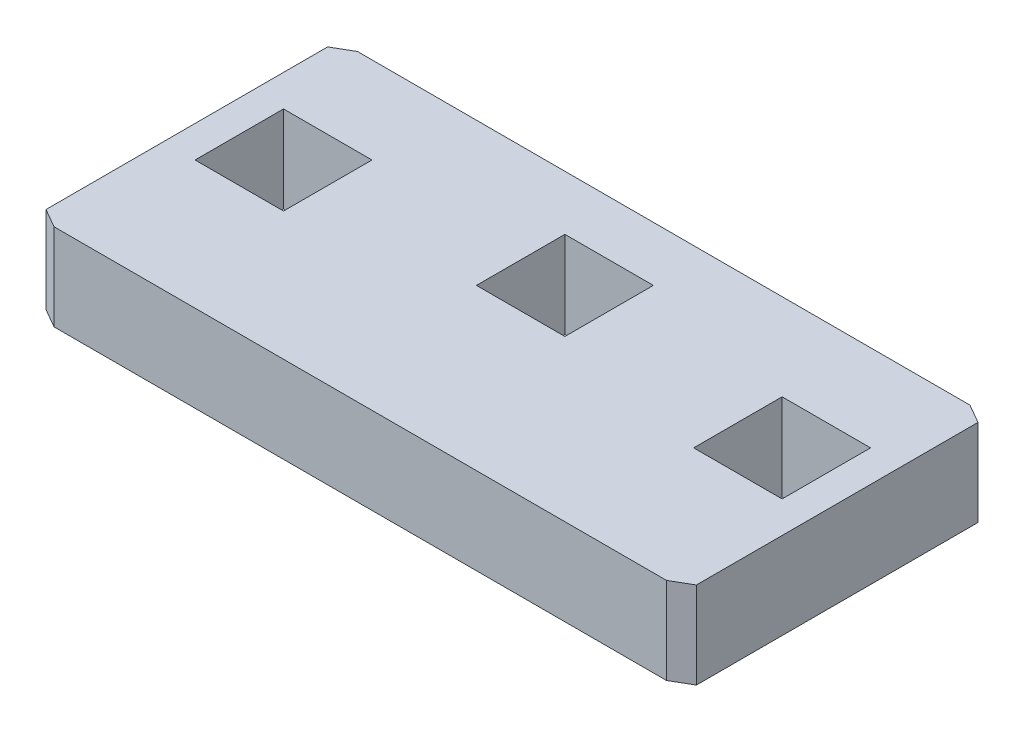
ISO-10303-21;
HEADER;
FILE_DESCRIPTION(('STEP AP214'),'2;1');
FILE_NAME('part.step','',(''),(''),'','','');
FILE_SCHEMA(('AUTOMOTIVE_DESIGN { 1 0 10303 214 1 1 1 1 }'));
ENDSEC;
DATA;
#1=APPLICATION_CONTEXT('core data for automotive mechanical design processes');
#2=APPLICATION_PROTOCOL_DEFINITION('international standard','automotive_design',2000,#1);
#3=PRODUCT_CONTEXT('',#1,'mechanical');
#4=PRODUCT('Part','Part','',(#3));
#5=PRODUCT_RELATED_PRODUCT_CATEGORY('part','',(#4));
#6=PRODUCT_DEFINITION_FORMATION('','',#4);
#7=PRODUCT_DEFINITION_CONTEXT('part definition',#1,'design');
#8=PRODUCT_DEFINITION('design','',#6,#7);
#9=PRODUCT_DEFINITION_SHAPE('','',#8);
#10=(LENGTH_UNIT() NAMED_UNIT(*) SI_UNIT(.MILLI.,.METRE.));
#11=(NAMED_UNIT(*) PLANE_ANGLE_UNIT() SI_UNIT($,.RADIAN.));
#12=(NAMED_UNIT(*) SI_UNIT($,.STERADIAN.) SOLID_ANGLE_UNIT());
#13=UNCERTAINTY_MEASURE_WITH_UNIT(LENGTH_MEASURE(1.E-05),#10,'distance_accuracy_value','');
#14=(GEOMETRIC_REPRESENTATION_CONTEXT(3) GLOBAL_UNCERTAINTY_ASSIGNED_CONTEXT((#13)) GLOBAL_UNIT_ASSIGNED_CONTEXT((#10,
#11,#12)) REPRESENTATION_CONTEXT('',''));
#15=CARTESIAN_POINT('',(0.,0.,0.));
#16=DIRECTION('',(0.,0.,1.));
#17=DIRECTION('',(1.,0.,0.));
#18=AXIS2_PLACEMENT_3D('',#15,#16,#17);
#19=CARTESIAN_POINT('',(-75.,20.,-35.));
#20=DIRECTION('',(1.,0.,0.));
#21=DIRECTION('',(0.,0.,-1.));
#22=AXIS2_PLACEMENT_3D('',#19,#20,#21);
#23=PLANE('',#22);
#24=DIRECTION('',(0.,0.,1.));
#25=VECTOR('',#24,1.);
#26=CARTESIAN_POINT('',(-75.,20.,-35.));
#27=LINE('',#26,#25);
#28=CARTESIAN_POINT('',(-75.,20.,-32.48));
#29=VERTEX_POINT('',#28);
#30=CARTESIAN_POINT('',(-75.,20.,32.48));
#31=VERTEX_POINT('',#30);
#32=EDGE_CURVE('E199',#29,#31,#27,.T.);
#33=ORIENTED_EDGE('',*,*,#32,.F.);
#34=DIRECTION('',(0.,1.,0.));
#35=VECTOR('',#34,1.);
#36=CARTESIAN_POINT('',(-75.,0.,-32.48));
#37=LINE('',#36,#35);
#38=CARTESIAN_POINT('',(-75.,0.,-32.48));
#39=VERTEX_POINT('',#38);
#40=EDGE_CURVE('E382',#39,#29,#37,.T.);
#41=ORIENTED_EDGE('',*,*,#40,.F.);
#42=DIRECTION('',(0.,0.,1.));
#43=VECTOR('',#42,1.);
#44=CARTESIAN_POINT('',(-75.,0.,-35.));
#45=LINE('',#44,#43);
#46=CARTESIAN_POINT('',(-75.,0.,32.48));
#47=VERTEX_POINT('',#46);
#48=EDGE_CURVE('E211',#39,#47,#45,.T.);
#49=ORIENTED_EDGE('',*,*,#48,.T.);
#50=DIRECTION('',(0.,1.,0.));
#51=VECTOR('',#50,1.);
#52=CARTESIAN_POINT('',(-75.,0.,32.48));
#53=LINE('',#52,#51);
#54=EDGE_CURVE('E299',#47,#31,#53,.T.);
#55=ORIENTED_EDGE('',*,*,#54,.T.);
#56=EDGE_LOOP('',(#33,#41,#49,#55));
#57=FACE_BOUND('',#56,.T.);
#58=ADVANCED_FACE('F39',(#57),#23,.F.);
#59=CARTESIAN_POINT('',(-75.,20.,35.));
#60=DIRECTION('',(0.,0.,-1.));
#61=DIRECTION('',(-1.,0.,0.));
#62=AXIS2_PLACEMENT_3D('',#59,#60,#61);
#63=PLANE('',#62);
#64=DIRECTION('',(1.,0.,0.));
#65=VECTOR('',#64,1.);
#66=CARTESIAN_POINT('',(-75.,0.,35.));
#67=LINE('',#66,#65);
#68=CARTESIAN_POINT('',(-70.6352319649264,0.,35.));
#69=VERTEX_POINT('',#68);
#70=CARTESIAN_POINT('',(70.6352319649264,0.,35.));
#71=VERTEX_POINT('',#70);
#72=EDGE_CURVE('E206',#69,#71,#67,.T.);
#73=ORIENTED_EDGE('',*,*,#72,.T.);
#74=DIRECTION('',(0.,1.,0.));
#75=VECTOR('',#74,1.);
#76=CARTESIAN_POINT('',(70.6352319649264,0.,35.));
#77=LINE('',#76,#75);
#78=CARTESIAN_POINT('',(70.6352319649264,20.,35.));
#79=VERTEX_POINT('',#78);
#80=EDGE_CURVE('E56',#71,#79,#77,.T.);
#81=ORIENTED_EDGE('',*,*,#80,.T.);
#82=DIRECTION('',(1.,0.,0.));
#83=VECTOR('',#82,1.);
#84=CARTESIAN_POINT('',(-75.,20.,35.));
#85=LINE('',#84,#83);
#86=CARTESIAN_POINT('',(-70.6352319649264,20.,35.));
#87=VERTEX_POINT('',#86);
#88=EDGE_CURVE('E204',#87,#79,#85,.T.);
#89=ORIENTED_EDGE('',*,*,#88,.F.);
#90=DIRECTION('',(0.,1.,0.));
#91=VECTOR('',#90,1.);
#92=CARTESIAN_POINT('',(-70.6352319649264,0.,35.));
#93=LINE('',#92,#91);
#94=EDGE_CURVE('E356',#69,#87,#93,.T.);
#95=ORIENTED_EDGE('',*,*,#94,.F.);
#96=EDGE_LOOP('',(#73,#81,#89,#95));
#97=FACE_BOUND('',#96,.T.);
#98=ADVANCED_FACE('F405',(#97),#63,.F.);
#99=CARTESIAN_POINT('',(75.,20.,-35.));
#100=DIRECTION('',(-1.,0.,0.));
#101=DIRECTION('',(0.,0.,1.));
#102=AXIS2_PLACEMENT_3D('',#99,#100,#101);
#103=PLANE('',#102);
#104=DIRECTION('',(0.,0.,-1.));
#105=VECTOR('',#104,1.);
#106=CARTESIAN_POINT('',(75.,20.,-35.));
#107=LINE('',#106,#105);
#108=CARTESIAN_POINT('',(75.,20.,32.4800000000001));
#109=VERTEX_POINT('',#108);
#110=CARTESIAN_POINT('',(75.,20.,-32.4800000000001));
#111=VERTEX_POINT('',#110);
#112=EDGE_CURVE('E48',#109,#111,#107,.T.);
#113=ORIENTED_EDGE('',*,*,#112,.F.);
#114=DIRECTION('',(0.,1.,0.));
#115=VECTOR('',#114,1.);
#116=CARTESIAN_POINT('',(75.,0.,32.4800000000001));
#117=LINE('',#116,#115);
#118=CARTESIAN_POINT('',(75.,0.,32.4800000000001));
#119=VERTEX_POINT('',#118);
#120=EDGE_CURVE('E370',#119,#109,#117,.T.);
#121=ORIENTED_EDGE('',*,*,#120,.F.);
#122=DIRECTION('',(0.,0.,-1.));
#123=VECTOR('',#122,1.);
#124=CARTESIAN_POINT('',(75.,0.,-35.));
#125=LINE('',#124,#123);
#126=CARTESIAN_POINT('',(75.,0.,-32.4800000000001));
#127=VERTEX_POINT('',#126);
#128=EDGE_CURVE('E200',#119,#127,#125,.T.);
#129=ORIENTED_EDGE('',*,*,#128,.T.);
#130=DIRECTION('',(0.,1.,0.));
#131=VECTOR('',#130,1.);
#132=CARTESIAN_POINT('',(75.,0.,-32.4800000000001));
#133=LINE('',#132,#131);
#134=EDGE_CURVE('E64',#127,#111,#133,.T.);
#135=ORIENTED_EDGE('',*,*,#134,.T.);
#136=EDGE_LOOP('',(#113,#121,#129,#135));
#137=FACE_BOUND('',#136,.T.);
#138=ADVANCED_FACE('F396',(#137),#103,.F.);
#139=CARTESIAN_POINT('',(-75.,20.,-35.));
#140=DIRECTION('',(0.,0.,1.));
#141=DIRECTION('',(1.,0.,0.));
#142=AXIS2_PLACEMENT_3D('',#139,#140,#141);
#143=PLANE('',#142);
#144=DIRECTION('',(-1.,0.,0.));
#145=VECTOR('',#144,1.);
#146=CARTESIAN_POINT('',(-75.,0.,-35.));
#147=LINE('',#146,#145);
#148=CARTESIAN_POINT('',(70.6352319649264,0.,-35.));
#149=VERTEX_POINT('',#148);
#150=CARTESIAN_POINT('',(-70.6352319649265,0.,-35.));
#151=VERTEX_POINT('',#150);
#152=EDGE_CURVE('E42',#149,#151,#147,.T.);
#153=ORIENTED_EDGE('',*,*,#152,.T.);
#154=DIRECTION('',(0.,1.,0.));
#155=VECTOR('',#154,1.);
#156=CARTESIAN_POINT('',(-70.6352319649264,0.,-35.));
#157=LINE('',#156,#155);
#158=CARTESIAN_POINT('',(-70.6352319649264,20.,-35.));
#159=VERTEX_POINT('',#158);
#160=EDGE_CURVE('E366',#151,#159,#157,.T.);
#161=ORIENTED_EDGE('',*,*,#160,.T.);
#162=DIRECTION('',(-1.,0.,0.));
#163=VECTOR('',#162,1.);
#164=CARTESIAN_POINT('',(-75.,20.,-35.));
#165=LINE('',#164,#163);
#166=CARTESIAN_POINT('',(70.6352319649264,20.,-35.));
#167=VERTEX_POINT('',#166);
#168=EDGE_CURVE('E11',#167,#159,#165,.T.);
#169=ORIENTED_EDGE('',*,*,#168,.F.);
#170=DIRECTION('',(0.,1.,0.));
#171=VECTOR('',#170,1.);
#172=CARTESIAN_POINT('',(70.6352319649264,0.,-35.));
#173=LINE('',#172,#171);
#174=EDGE_CURVE('E178',#149,#167,#173,.T.);
#175=ORIENTED_EDGE('',*,*,#174,.F.);
#176=EDGE_LOOP('',(#153,#161,#169,#175));
#177=FACE_BOUND('',#176,.T.);
#178=ADVANCED_FACE('F190',(#177),#143,.F.);
#179=CARTESIAN_POINT('',(0.,20.,0.));
#180=DIRECTION('',(0.,1.,0.));
#181=DIRECTION('',(0.,0.,1.));
#182=AXIS2_PLACEMENT_3D('',#179,#180,#181);
#183=PLANE('',#182);
#184=DIRECTION('',(0.866025403784441,0.,-0.499999999999996));
#185=VECTOR('',#184,1.);
#186=CARTESIAN_POINT('',(-70.6352319649264,20.,-35.));
#187=LINE('',#186,#185);
#188=EDGE_CURVE('E376',#29,#159,#187,.T.);
#189=ORIENTED_EDGE('',*,*,#188,.F.);
#190=ORIENTED_EDGE('',*,*,#32,.T.);
#191=DIRECTION('',(-0.866025403784441,0.,-0.499999999999996));
#192=VECTOR('',#191,1.);
#193=CARTESIAN_POINT('',(-70.6352319649264,20.,35.));
#194=LINE('',#193,#192);
#195=EDGE_CURVE('E363',#87,#31,#194,.T.);
#196=ORIENTED_EDGE('',*,*,#195,.F.);
#197=ORIENTED_EDGE('',*,*,#88,.T.);
#198=DIRECTION('',(-0.866025403784442,0.,0.499999999999995));
#199=VECTOR('',#198,1.);
#200=CARTESIAN_POINT('',(70.6352319649264,20.,35.));
#201=LINE('',#200,#199);
#202=EDGE_CURVE('E377',#109,#79,#201,.T.);
#203=ORIENTED_EDGE('',*,*,#202,.F.);
#204=ORIENTED_EDGE('',*,*,#112,.T.);
#205=DIRECTION('',(0.866025403784442,0.,0.499999999999995));
#206=VECTOR('',#205,1.);
#207=CARTESIAN_POINT('',(70.6352319649264,20.,-35.));
#208=LINE('',#207,#206);
#209=EDGE_CURVE('E185',#167,#111,#208,.T.);
#210=ORIENTED_EDGE('',*,*,#209,.F.);
#211=ORIENTED_EDGE('',*,*,#168,.T.);
#212=EDGE_LOOP('',(#189,#190,#196,#197,#203,#204,#210,#211));
#213=FACE_BOUND('',#212,.T.);
#214=DIRECTION('',(0.,0.,1.));
#215=VECTOR('',#214,1.);
#216=CARTESIAN_POINT('',(-67.7,20.,-15.));
#217=LINE('',#216,#215);
#218=CARTESIAN_POINT('',(-67.7,20.,-15.));
#219=VERTEX_POINT('',#218);
#220=CARTESIAN_POINT('',(-67.7,20.,5.4));
#221=VERTEX_POINT('',#220);
#222=EDGE_CURVE('E282',#219,#221,#217,.T.);
#223=ORIENTED_EDGE('',*,*,#222,.F.);
#224=DIRECTION('',(-1.,0.,0.));
#225=VECTOR('',#224,1.);
#226=CARTESIAN_POINT('',(-67.7,20.,-15.));
#227=LINE('',#226,#225);
#228=CARTESIAN_POINT('',(-47.3,20.,-15.));
#229=VERTEX_POINT('',#228);
#230=EDGE_CURVE('E327',#229,#219,#227,.T.);
#231=ORIENTED_EDGE('',*,*,#230,.F.);
#232=DIRECTION('',(0.,0.,-1.));
#233=VECTOR('',#232,1.);
#234=CARTESIAN_POINT('',(-47.3,20.,-15.));
#235=LINE('',#234,#233);
#236=CARTESIAN_POINT('',(-47.3,20.,5.4));
#237=VERTEX_POINT('',#236);
#238=EDGE_CURVE('E332',#237,#229,#235,.T.);
#239=ORIENTED_EDGE('',*,*,#238,.F.);
#240=DIRECTION('',(1.,0.,0.));
#241=VECTOR('',#240,1.);
#242=CARTESIAN_POINT('',(-67.7,20.,5.4));
#243=LINE('',#242,#241);
#244=EDGE_CURVE('E336',#221,#237,#243,.T.);
#245=ORIENTED_EDGE('',*,*,#244,.F.);
#246=EDGE_LOOP('',(#223,#231,#239,#245));
#247=FACE_BOUND('',#246,.T.);
#248=DIRECTION('',(0.,0.,-1.));
#249=VECTOR('',#248,1.);
#250=CARTESIAN_POINT('',(67.7,20.,-15.));
#251=LINE('',#250,#249);
#252=CARTESIAN_POINT('',(67.7,20.,5.39999999999998));
#253=VERTEX_POINT('',#252);
#254=CARTESIAN_POINT('',(67.7,20.,-15.));
#255=VERTEX_POINT('',#254);
#256=EDGE_CURVE('E296',#253,#255,#251,.T.);
#257=ORIENTED_EDGE('',*,*,#256,.F.);
#258=DIRECTION('',(1.,0.,0.));
#259=VECTOR('',#258,1.);
#260=CARTESIAN_POINT('',(67.7,20.,5.39999999999998));
#261=LINE('',#260,#259);
#262=CARTESIAN_POINT('',(47.3,20.,5.39999999999998));
#263=VERTEX_POINT('',#262);
#264=EDGE_CURVE('E283',#263,#253,#261,.T.);
#265=ORIENTED_EDGE('',*,*,#264,.F.);
#266=DIRECTION('',(0.,0.,1.));
#267=VECTOR('',#266,1.);
#268=CARTESIAN_POINT('',(47.3,20.,-15.));
#269=LINE('',#268,#267);
#270=CARTESIAN_POINT('',(47.3,20.,-15.));
#271=VERTEX_POINT('',#270);
#272=EDGE_CURVE('E288',#271,#263,#269,.T.);
#273=ORIENTED_EDGE('',*,*,#272,.F.);
#274=DIRECTION('',(-1.,0.,0.));
#275=VECTOR('',#274,1.);
#276=CARTESIAN_POINT('',(67.7,20.,-15.));
#277=LINE('',#276,#275);
#278=EDGE_CURVE('E292',#255,#271,#277,.T.);
#279=ORIENTED_EDGE('',*,*,#278,.F.);
#280=EDGE_LOOP('',(#257,#265,#273,#279));
#281=FACE_BOUND('',#280,.T.);
#282=DIRECTION('',(0.,0.,1.));
#283=VECTOR('',#282,1.);
#284=CARTESIAN_POINT('',(-10.2,20.,-22.4));
#285=LINE('',#284,#283);
#286=CARTESIAN_POINT('',(-10.2,20.,-22.4));
#287=VERTEX_POINT('',#286);
#288=CARTESIAN_POINT('',(-10.2,20.,-2.));
#289=VERTEX_POINT('',#288);
#290=EDGE_CURVE('E250',#287,#289,#285,.T.);
#291=ORIENTED_EDGE('',*,*,#290,.F.);
#292=DIRECTION('',(-1.,0.,0.));
#293=VECTOR('',#292,1.);
#294=CARTESIAN_POINT('',(-10.2,20.,-22.4));
#295=LINE('',#294,#293);
#296=CARTESIAN_POINT('',(10.2,20.,-22.4));
#297=VERTEX_POINT('',#296);
#298=EDGE_CURVE('E237',#297,#287,#295,.T.);
#299=ORIENTED_EDGE('',*,*,#298,.F.);
#300=DIRECTION('',(0.,0.,-1.));
#301=VECTOR('',#300,1.);
#302=CARTESIAN_POINT('',(10.2,20.,-22.4));
#303=LINE('',#302,#301);
#304=CARTESIAN_POINT('',(10.2,20.,-2.));
#305=VERTEX_POINT('',#304);
#306=EDGE_CURVE('E242',#305,#297,#303,.T.);
#307=ORIENTED_EDGE('',*,*,#306,.F.);
#308=DIRECTION('',(1.,0.,0.));
#309=VECTOR('',#308,1.);
#310=CARTESIAN_POINT('',(-10.2,20.,-2.));
#311=LINE('',#310,#309);
#312=EDGE_CURVE('E246',#289,#305,#311,.T.);
#313=ORIENTED_EDGE('',*,*,#312,.F.);
#314=EDGE_LOOP('',(#291,#299,#307,#313));
#315=FACE_BOUND('',#314,.T.);
#316=ADVANCED_FACE('F399',(#213,#247,#281,#315),#183,.T.);
#317=CARTESIAN_POINT('',(0.,0.,0.));
#318=DIRECTION('',(0.,1.,0.));
#319=DIRECTION('',(0.,0.,1.));
#320=AXIS2_PLACEMENT_3D('',#317,#318,#319);
#321=PLANE('',#320);
#322=DIRECTION('',(-1.,0.,0.));
#323=VECTOR('',#322,1.);
#324=CARTESIAN_POINT('',(-67.7,0.,-15.));
#325=LINE('',#324,#323);
#326=CARTESIAN_POINT('',(-47.3,0.,-15.));
#327=VERTEX_POINT('',#326);
#328=CARTESIAN_POINT('',(-67.7,0.,-15.));
#329=VERTEX_POINT('',#328);
#330=EDGE_CURVE('E319',#327,#329,#325,.T.);
#331=ORIENTED_EDGE('',*,*,#330,.T.);
#332=DIRECTION('',(0.,0.,1.));
#333=VECTOR('',#332,1.);
#334=CARTESIAN_POINT('',(-67.7,0.,-15.));
#335=LINE('',#334,#333);
#336=CARTESIAN_POINT('',(-67.7,0.,5.4));
#337=VERTEX_POINT('',#336);
#338=EDGE_CURVE('E331',#329,#337,#335,.T.);
#339=ORIENTED_EDGE('',*,*,#338,.T.);
#340=DIRECTION('',(1.,0.,0.));
#341=VECTOR('',#340,1.);
#342=CARTESIAN_POINT('',(-67.7,0.,5.4));
#343=LINE('',#342,#341);
#344=CARTESIAN_POINT('',(-47.3,0.,5.4));
#345=VERTEX_POINT('',#344);
#346=EDGE_CURVE('E349',#337,#345,#343,.T.);
#347=ORIENTED_EDGE('',*,*,#346,.T.);
#348=DIRECTION('',(0.,0.,-1.));
#349=VECTOR('',#348,1.);
#350=CARTESIAN_POINT('',(-47.3,0.,-15.));
#351=LINE('',#350,#349);
#352=EDGE_CURVE('E345',#345,#327,#351,.T.);
#353=ORIENTED_EDGE('',*,*,#352,.T.);
#354=EDGE_LOOP('',(#331,#339,#347,#353));
#355=FACE_BOUND('',#354,.T.);
#356=DIRECTION('',(1.,0.,0.));
#357=VECTOR('',#356,1.);
#358=CARTESIAN_POINT('',(67.7,0.,5.39999999999998));
#359=LINE('',#358,#357);
#360=CARTESIAN_POINT('',(47.3,0.,5.39999999999998));
#361=VERTEX_POINT('',#360);
#362=CARTESIAN_POINT('',(67.7,0.,5.39999999999998));
#363=VERTEX_POINT('',#362);
#364=EDGE_CURVE('E273',#361,#363,#359,.T.);
#365=ORIENTED_EDGE('',*,*,#364,.T.);
#366=DIRECTION('',(0.,0.,-1.));
#367=VECTOR('',#366,1.);
#368=CARTESIAN_POINT('',(67.7,0.,-15.));
#369=LINE('',#368,#367);
#370=CARTESIAN_POINT('',(67.7,0.,-15.));
#371=VERTEX_POINT('',#370);
#372=EDGE_CURVE('E287',#363,#371,#369,.T.);
#373=ORIENTED_EDGE('',*,*,#372,.T.);
#374=DIRECTION('',(-1.,0.,0.));
#375=VECTOR('',#374,1.);
#376=CARTESIAN_POINT('',(67.7,0.,-15.));
#377=LINE('',#376,#375);
#378=CARTESIAN_POINT('',(47.3,0.,-15.));
#379=VERTEX_POINT('',#378);
#380=EDGE_CURVE('E307',#371,#379,#377,.T.);
#381=ORIENTED_EDGE('',*,*,#380,.T.);
#382=DIRECTION('',(0.,0.,1.));
#383=VECTOR('',#382,1.);
#384=CARTESIAN_POINT('',(47.3,0.,-15.));
#385=LINE('',#384,#383);
#386=EDGE_CURVE('E303',#379,#361,#385,.T.);
#387=ORIENTED_EDGE('',*,*,#386,.T.);
#388=EDGE_LOOP('',(#365,#373,#381,#387));
#389=FACE_BOUND('',#388,.T.);
#390=DIRECTION('',(-1.,0.,0.));
#391=VECTOR('',#390,1.);
#392=CARTESIAN_POINT('',(-10.2,0.,-22.4));
#393=LINE('',#392,#391);
#394=CARTESIAN_POINT('',(10.2,0.,-22.4));
#395=VERTEX_POINT('',#394);
#396=CARTESIAN_POINT('',(-10.2,0.,-22.4));
#397=VERTEX_POINT('',#396);
#398=EDGE_CURVE('E229',#395,#397,#393,.T.);
#399=ORIENTED_EDGE('',*,*,#398,.T.);
#400=DIRECTION('',(0.,0.,1.));
#401=VECTOR('',#400,1.);
#402=CARTESIAN_POINT('',(-10.2,0.,-22.4));
#403=LINE('',#402,#401);
#404=CARTESIAN_POINT('',(-10.2,0.,-2.));
#405=VERTEX_POINT('',#404);
#406=EDGE_CURVE('E241',#397,#405,#403,.T.);
#407=ORIENTED_EDGE('',*,*,#406,.T.);
#408=DIRECTION('',(1.,0.,0.));
#409=VECTOR('',#408,1.);
#410=CARTESIAN_POINT('',(-10.2,0.,-2.));
#411=LINE('',#410,#409);
#412=CARTESIAN_POINT('',(10.2,0.,-2.));
#413=VERTEX_POINT('',#412);
#414=EDGE_CURVE('E261',#405,#413,#411,.T.);
#415=ORIENTED_EDGE('',*,*,#414,.T.);
#416=DIRECTION('',(0.,0.,-1.));
#417=VECTOR('',#416,1.);
#418=CARTESIAN_POINT('',(10.2,0.,-22.4));
#419=LINE('',#418,#417);
#420=EDGE_CURVE('E257',#413,#395,#419,.T.);
#421=ORIENTED_EDGE('',*,*,#420,.T.);
#422=EDGE_LOOP('',(#399,#407,#415,#421));
#423=FACE_BOUND('',#422,.T.);
#424=ORIENTED_EDGE('',*,*,#48,.F.);
#425=DIRECTION('',(0.866025403784441,0.,-0.499999999999996));
#426=VECTOR('',#425,1.);
#427=CARTESIAN_POINT('',(-70.6352319649264,0.,-35.));
#428=LINE('',#427,#426);
#429=EDGE_CURVE('E197',#39,#151,#428,.T.);
#430=ORIENTED_EDGE('',*,*,#429,.T.);
#431=ORIENTED_EDGE('',*,*,#152,.F.);
#432=DIRECTION('',(0.866025403784442,0.,0.499999999999995));
#433=VECTOR('',#432,1.);
#434=CARTESIAN_POINT('',(70.6352319649264,0.,-35.));
#435=LINE('',#434,#433);
#436=EDGE_CURVE('E175',#149,#127,#435,.T.);
#437=ORIENTED_EDGE('',*,*,#436,.T.);
#438=ORIENTED_EDGE('',*,*,#128,.F.);
#439=DIRECTION('',(-0.866025403784442,0.,0.499999999999995));
#440=VECTOR('',#439,1.);
#441=CARTESIAN_POINT('',(70.6352319649264,0.,35.));
#442=LINE('',#441,#440);
#443=EDGE_CURVE('E373',#119,#71,#442,.T.);
#444=ORIENTED_EDGE('',*,*,#443,.T.);
#445=ORIENTED_EDGE('',*,*,#72,.F.);
#446=DIRECTION('',(-0.866025403784441,0.,-0.499999999999996));
#447=VECTOR('',#446,1.);
#448=CARTESIAN_POINT('',(-70.6352319649264,0.,35.));
#449=LINE('',#448,#447);
#450=EDGE_CURVE('E359',#69,#47,#449,.T.);
#451=ORIENTED_EDGE('',*,*,#450,.T.);
#452=EDGE_LOOP('',(#424,#430,#431,#437,#438,#444,#445,#451));
#453=FACE_BOUND('',#452,.T.);
#454=ADVANCED_FACE('F196',(#355,#389,#423,#453),#321,.F.);
#455=CARTESIAN_POINT('',(-10.2,0.,-22.4));
#456=DIRECTION('',(-1.,0.,0.));
#457=DIRECTION('',(0.,0.,1.));
#458=AXIS2_PLACEMENT_3D('',#455,#456,#457);
#459=PLANE('',#458);
#460=ORIENTED_EDGE('',*,*,#290,.T.);
#461=DIRECTION('',(0.,1.,0.));
#462=VECTOR('',#461,1.);
#463=CARTESIAN_POINT('',(-10.2,0.,-2.));
#464=LINE('',#463,#462);
#465=EDGE_CURVE('E224',#405,#289,#464,.T.);
#466=ORIENTED_EDGE('',*,*,#465,.F.);
#467=ORIENTED_EDGE('',*,*,#406,.F.);
#468=DIRECTION('',(0.,1.,0.));
#469=VECTOR('',#468,1.);
#470=CARTESIAN_POINT('',(-10.2,0.,-22.4));
#471=LINE('',#470,#469);
#472=EDGE_CURVE('E216',#397,#287,#471,.T.);
#473=ORIENTED_EDGE('',*,*,#472,.T.);
#474=EDGE_LOOP('',(#460,#466,#467,#473));
#475=FACE_BOUND('',#474,.T.);
#476=ADVANCED_FACE('F441',(#475),#459,.F.);
#477=CARTESIAN_POINT('',(-10.2,0.,-22.4));
#478=DIRECTION('',(0.,0.,-1.));
#479=DIRECTION('',(-1.,0.,0.));
#480=AXIS2_PLACEMENT_3D('',#477,#478,#479);
#481=PLANE('',#480);
#482=ORIENTED_EDGE('',*,*,#298,.T.);
#483=ORIENTED_EDGE('',*,*,#472,.F.);
#484=ORIENTED_EDGE('',*,*,#398,.F.);
#485=DIRECTION('',(0.,1.,0.));
#486=VECTOR('',#485,1.);
#487=CARTESIAN_POINT('',(10.2,0.,-22.4));
#488=LINE('',#487,#486);
#489=EDGE_CURVE('E232',#395,#297,#488,.T.);
#490=ORIENTED_EDGE('',*,*,#489,.T.);
#491=EDGE_LOOP('',(#482,#483,#484,#490));
#492=FACE_BOUND('',#491,.T.);
#493=ADVANCED_FACE('F447',(#492),#481,.F.);
#494=CARTESIAN_POINT('',(10.2,0.,-22.4));
#495=DIRECTION('',(1.,0.,0.));
#496=DIRECTION('',(0.,0.,-1.));
#497=AXIS2_PLACEMENT_3D('',#494,#495,#496);
#498=PLANE('',#497);
#499=ORIENTED_EDGE('',*,*,#306,.T.);
#500=ORIENTED_EDGE('',*,*,#489,.F.);
#501=ORIENTED_EDGE('',*,*,#420,.F.);
#502=DIRECTION('',(0.,1.,0.));
#503=VECTOR('',#502,1.);
#504=CARTESIAN_POINT('',(10.2,0.,-2.));
#505=LINE('',#504,#503);
#506=EDGE_CURVE('E228',#413,#305,#505,.T.);
#507=ORIENTED_EDGE('',*,*,#506,.T.);
#508=EDGE_LOOP('',(#499,#500,#501,#507));
#509=FACE_BOUND('',#508,.T.);
#510=ADVANCED_FACE('F453',(#509),#498,.F.);
#511=CARTESIAN_POINT('',(-10.2,0.,-2.));
#512=DIRECTION('',(0.,0.,1.));
#513=DIRECTION('',(1.,0.,0.));
#514=AXIS2_PLACEMENT_3D('',#511,#512,#513);
#515=PLANE('',#514);
#516=ORIENTED_EDGE('',*,*,#312,.T.);
#517=ORIENTED_EDGE('',*,*,#506,.F.);
#518=ORIENTED_EDGE('',*,*,#414,.F.);
#519=ORIENTED_EDGE('',*,*,#465,.T.);
#520=EDGE_LOOP('',(#516,#517,#518,#519));
#521=FACE_BOUND('',#520,.T.);
#522=ADVANCED_FACE('F449',(#521),#515,.F.);
#523=CARTESIAN_POINT('',(67.7,0.,-15.));
#524=DIRECTION('',(1.,0.,0.));
#525=DIRECTION('',(0.,0.,-1.));
#526=AXIS2_PLACEMENT_3D('',#523,#524,#525);
#527=PLANE('',#526);
#528=ORIENTED_EDGE('',*,*,#256,.T.);
#529=DIRECTION('',(0.,1.,0.));
#530=VECTOR('',#529,1.);
#531=CARTESIAN_POINT('',(67.7,0.,-15.));
#532=LINE('',#531,#530);
#533=EDGE_CURVE('E268',#371,#255,#532,.T.);
#534=ORIENTED_EDGE('',*,*,#533,.F.);
#535=ORIENTED_EDGE('',*,*,#372,.F.);
#536=DIRECTION('',(0.,1.,0.));
#537=VECTOR('',#536,1.);
#538=CARTESIAN_POINT('',(67.7,0.,5.39999999999998));
#539=LINE('',#538,#537);
#540=EDGE_CURVE('E279',#363,#253,#539,.T.);
#541=ORIENTED_EDGE('',*,*,#540,.T.);
#542=EDGE_LOOP('',(#528,#534,#535,#541));
#543=FACE_BOUND('',#542,.T.);
#544=ADVANCED_FACE('F452',(#543),#527,.F.);
#545=CARTESIAN_POINT('',(67.7,0.,5.39999999999998));
#546=DIRECTION('',(0.,0.,1.));
#547=DIRECTION('',(1.,0.,0.));
#548=AXIS2_PLACEMENT_3D('',#545,#546,#547);
#549=PLANE('',#548);
#550=ORIENTED_EDGE('',*,*,#264,.T.);
#551=ORIENTED_EDGE('',*,*,#540,.F.);
#552=ORIENTED_EDGE('',*,*,#364,.F.);
#553=DIRECTION('',(0.,1.,0.));
#554=VECTOR('',#553,1.);
#555=CARTESIAN_POINT('',(47.3,0.,5.39999999999998));
#556=LINE('',#555,#554);
#557=EDGE_CURVE('E276',#361,#263,#556,.T.);
#558=ORIENTED_EDGE('',*,*,#557,.T.);
#559=EDGE_LOOP('',(#550,#551,#552,#558));
#560=FACE_BOUND('',#559,.T.);
#561=ADVANCED_FACE('F463',(#560),#549,.F.);
#562=CARTESIAN_POINT('',(47.3,0.,-15.));
#563=DIRECTION('',(-1.,0.,0.));
#564=DIRECTION('',(0.,0.,1.));
#565=AXIS2_PLACEMENT_3D('',#562,#563,#564);
#566=PLANE('',#565);
#567=ORIENTED_EDGE('',*,*,#272,.T.);
#568=ORIENTED_EDGE('',*,*,#557,.F.);
#569=ORIENTED_EDGE('',*,*,#386,.F.);
#570=DIRECTION('',(0.,1.,0.));
#571=VECTOR('',#570,1.);
#572=CARTESIAN_POINT('',(47.3,0.,-15.));
#573=LINE('',#572,#571);
#574=EDGE_CURVE('E272',#379,#271,#573,.T.);
#575=ORIENTED_EDGE('',*,*,#574,.T.);
#576=EDGE_LOOP('',(#567,#568,#569,#575));
#577=FACE_BOUND('',#576,.T.);
#578=ADVANCED_FACE('F469',(#577),#566,.F.);
#579=CARTESIAN_POINT('',(67.7,0.,-15.));
#580=DIRECTION('',(0.,0.,-1.));
#581=DIRECTION('',(-1.,0.,0.));
#582=AXIS2_PLACEMENT_3D('',#579,#580,#581);
#583=PLANE('',#582);
#584=ORIENTED_EDGE('',*,*,#278,.T.);
#585=ORIENTED_EDGE('',*,*,#574,.F.);
#586=ORIENTED_EDGE('',*,*,#380,.F.);
#587=ORIENTED_EDGE('',*,*,#533,.T.);
#588=EDGE_LOOP('',(#584,#585,#586,#587));
#589=FACE_BOUND('',#588,.T.);
#590=ADVANCED_FACE('F465',(#589),#583,.F.);
#591=CARTESIAN_POINT('',(-67.7,0.,-15.));
#592=DIRECTION('',(-1.,0.,0.));
#593=DIRECTION('',(0.,0.,1.));
#594=AXIS2_PLACEMENT_3D('',#591,#592,#593);
#595=PLANE('',#594);
#596=ORIENTED_EDGE('',*,*,#222,.T.);
#597=DIRECTION('',(0.,1.,0.));
#598=VECTOR('',#597,1.);
#599=CARTESIAN_POINT('',(-67.7,0.,5.4));
#600=LINE('',#599,#598);
#601=EDGE_CURVE('E314',#337,#221,#600,.T.);
#602=ORIENTED_EDGE('',*,*,#601,.F.);
#603=ORIENTED_EDGE('',*,*,#338,.F.);
#604=DIRECTION('',(0.,1.,0.));
#605=VECTOR('',#604,1.);
#606=CARTESIAN_POINT('',(-67.7,0.,-15.));
#607=LINE('',#606,#605);
#608=EDGE_CURVE('E253',#329,#219,#607,.T.);
#609=ORIENTED_EDGE('',*,*,#608,.T.);
#610=EDGE_LOOP('',(#596,#602,#603,#609));
#611=FACE_BOUND('',#610,.T.);
#612=ADVANCED_FACE('F468',(#611),#595,.F.);
#613=CARTESIAN_POINT('',(-67.7,0.,-15.));
#614=DIRECTION('',(0.,0.,-1.));
#615=DIRECTION('',(-1.,0.,0.));
#616=AXIS2_PLACEMENT_3D('',#613,#614,#615);
#617=PLANE('',#616);
#618=ORIENTED_EDGE('',*,*,#230,.T.);
#619=ORIENTED_EDGE('',*,*,#608,.F.);
#620=ORIENTED_EDGE('',*,*,#330,.F.);
#621=DIRECTION('',(0.,1.,0.));
#622=VECTOR('',#621,1.);
#623=CARTESIAN_POINT('',(-47.3,0.,-15.));
#624=LINE('',#623,#622);
#625=EDGE_CURVE('E322',#327,#229,#624,.T.);
#626=ORIENTED_EDGE('',*,*,#625,.T.);
#627=EDGE_LOOP('',(#618,#619,#620,#626));
#628=FACE_BOUND('',#627,.T.);
#629=ADVANCED_FACE('F478',(#628),#617,.F.);
#630=CARTESIAN_POINT('',(-47.3,0.,-15.));
#631=DIRECTION('',(1.,0.,0.));
#632=DIRECTION('',(0.,0.,-1.));
#633=AXIS2_PLACEMENT_3D('',#630,#631,#632);
#634=PLANE('',#633);
#635=ORIENTED_EDGE('',*,*,#238,.T.);
#636=ORIENTED_EDGE('',*,*,#625,.F.);
#637=ORIENTED_EDGE('',*,*,#352,.F.);
#638=DIRECTION('',(0.,1.,0.));
#639=VECTOR('',#638,1.);
#640=CARTESIAN_POINT('',(-47.3,0.,5.4));
#641=LINE('',#640,#639);
#642=EDGE_CURVE('E318',#345,#237,#641,.T.);
#643=ORIENTED_EDGE('',*,*,#642,.T.);
#644=EDGE_LOOP('',(#635,#636,#637,#643));
#645=FACE_BOUND('',#644,.T.);
#646=ADVANCED_FACE('F423',(#645),#634,.F.);
#647=CARTESIAN_POINT('',(-67.7,0.,5.4));
#648=DIRECTION('',(0.,0.,1.));
#649=DIRECTION('',(1.,0.,0.));
#650=AXIS2_PLACEMENT_3D('',#647,#648,#649);
#651=PLANE('',#650);
#652=ORIENTED_EDGE('',*,*,#244,.T.);
#653=ORIENTED_EDGE('',*,*,#642,.F.);
#654=ORIENTED_EDGE('',*,*,#346,.F.);
#655=ORIENTED_EDGE('',*,*,#601,.T.);
#656=EDGE_LOOP('',(#652,#653,#654,#655));
#657=FACE_BOUND('',#656,.T.);
#658=ADVANCED_FACE('F416',(#657),#651,.F.);
#659=CARTESIAN_POINT('',(-70.6352319649264,0.,35.));
#660=DIRECTION('',(0.499999999999996,0.,-0.866025403784441));
#661=DIRECTION('',(-0.866025403784441,0.,-0.499999999999996));
#662=AXIS2_PLACEMENT_3D('',#659,#660,#661);
#663=PLANE('',#662);
#664=ORIENTED_EDGE('',*,*,#195,.T.);
#665=ORIENTED_EDGE('',*,*,#54,.F.);
#666=ORIENTED_EDGE('',*,*,#450,.F.);
#667=ORIENTED_EDGE('',*,*,#94,.T.);
#668=EDGE_LOOP('',(#664,#665,#666,#667));
#669=FACE_BOUND('',#668,.T.);
#670=ADVANCED_FACE('F414',(#669),#663,.F.);
#671=CARTESIAN_POINT('',(70.6352319649264,0.,-35.));
#672=DIRECTION('',(-0.499999999999995,0.,0.866025403784442));
#673=DIRECTION('',(0.866025403784442,0.,0.499999999999995));
#674=AXIS2_PLACEMENT_3D('',#671,#672,#673);
#675=PLANE('',#674);
#676=ORIENTED_EDGE('',*,*,#209,.T.);
#677=ORIENTED_EDGE('',*,*,#134,.F.);
#678=ORIENTED_EDGE('',*,*,#436,.F.);
#679=ORIENTED_EDGE('',*,*,#174,.T.);
#680=EDGE_LOOP('',(#676,#677,#678,#679));
#681=FACE_BOUND('',#680,.T.);
#682=ADVANCED_FACE('F177',(#681),#675,.F.);
#683=CARTESIAN_POINT('',(70.6352319649264,0.,35.));
#684=DIRECTION('',(-0.499999999999995,0.,-0.866025403784442));
#685=DIRECTION('',(-0.866025403784442,0.,0.499999999999995));
#686=AXIS2_PLACEMENT_3D('',#683,#684,#685);
#687=PLANE('',#686);
#688=ORIENTED_EDGE('',*,*,#202,.T.);
#689=ORIENTED_EDGE('',*,*,#80,.F.);
#690=ORIENTED_EDGE('',*,*,#443,.F.);
#691=ORIENTED_EDGE('',*,*,#120,.T.);
#692=EDGE_LOOP('',(#688,#689,#690,#691));
#693=FACE_BOUND('',#692,.T.);
#694=ADVANCED_FACE('F403',(#693),#687,.F.);
#695=CARTESIAN_POINT('',(-70.6352319649264,0.,-35.));
#696=DIRECTION('',(0.499999999999996,0.,0.866025403784441));
#697=DIRECTION('',(0.866025403784441,0.,-0.499999999999996));
#698=AXIS2_PLACEMENT_3D('',#695,#696,#697);
#699=PLANE('',#698);
#700=ORIENTED_EDGE('',*,*,#188,.T.);
#701=ORIENTED_EDGE('',*,*,#160,.F.);
#702=ORIENTED_EDGE('',*,*,#429,.F.);
#703=ORIENTED_EDGE('',*,*,#40,.T.);
#704=EDGE_LOOP('',(#700,#701,#702,#703));
#705=FACE_BOUND('',#704,.T.);
#706=ADVANCED_FACE('F413',(#705),#699,.F.);
#707=CLOSED_SHELL('',(#58,#98,#138,#178,#316,#454,#476,#493,#510,#522,#544,#561,#578,#590,#612,
#629,#646,#658,#670,#682,#694,#706));
#708=MANIFOLD_SOLID_BREP('B2',#707);
#709=ADVANCED_BREP_SHAPE_REPRESENTATION('',(#18,#708),#14);
#710=SHAPE_DEFINITION_REPRESENTATION(#9,#709);
ENDSEC;
END-ISO-10303-21;
